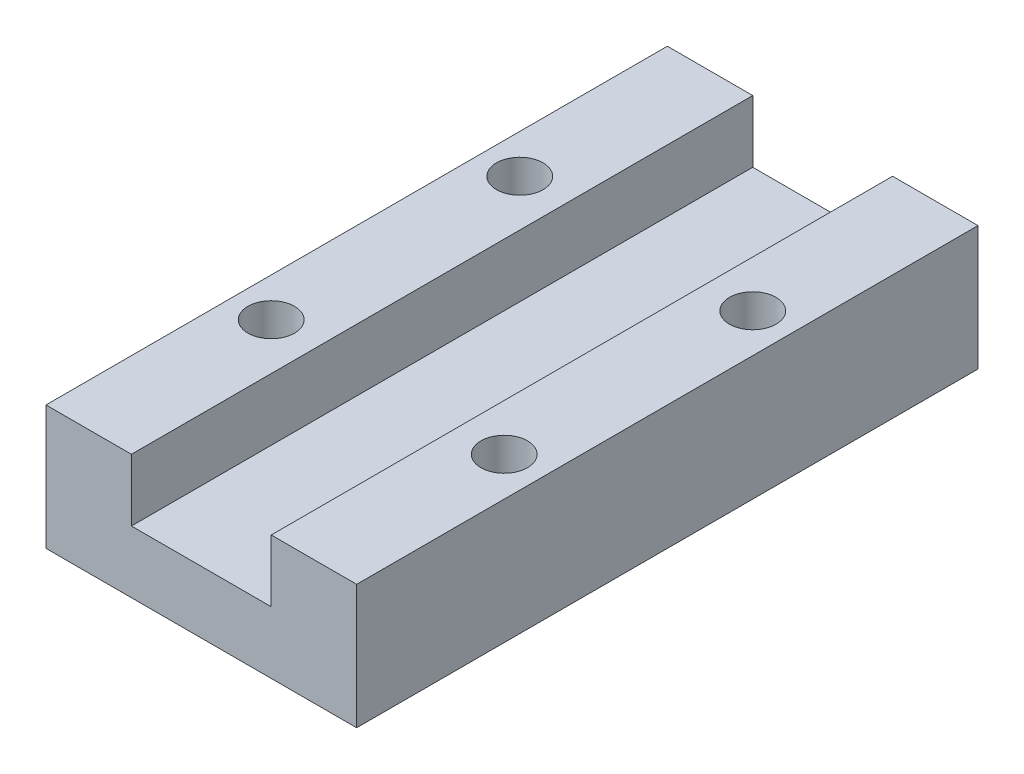
ISO-10303-21;
HEADER;
FILE_DESCRIPTION(('STEP AP214'),'2;1');
FILE_NAME('part.step','',(''),(''),'','','');
FILE_SCHEMA(('AUTOMOTIVE_DESIGN { 1 0 10303 214 1 1 1 1 }'));
ENDSEC;
DATA;
#1=APPLICATION_CONTEXT('core data for automotive mechanical design processes');
#2=APPLICATION_PROTOCOL_DEFINITION('international standard','automotive_design',2000,#1);
#3=PRODUCT_CONTEXT('',#1,'mechanical');
#4=PRODUCT('Part','Part','',(#3));
#5=PRODUCT_RELATED_PRODUCT_CATEGORY('part','',(#4));
#6=PRODUCT_DEFINITION_FORMATION('','',#4);
#7=PRODUCT_DEFINITION_CONTEXT('part definition',#1,'design');
#8=PRODUCT_DEFINITION('design','',#6,#7);
#9=PRODUCT_DEFINITION_SHAPE('','',#8);
#10=(LENGTH_UNIT() NAMED_UNIT(*) SI_UNIT(.MILLI.,.METRE.));
#11=(NAMED_UNIT(*) PLANE_ANGLE_UNIT() SI_UNIT($,.RADIAN.));
#12=(NAMED_UNIT(*) SI_UNIT($,.STERADIAN.) SOLID_ANGLE_UNIT());
#13=UNCERTAINTY_MEASURE_WITH_UNIT(LENGTH_MEASURE(1.E-05),#10,'distance_accuracy_value','');
#14=(GEOMETRIC_REPRESENTATION_CONTEXT(3) GLOBAL_UNCERTAINTY_ASSIGNED_CONTEXT((#13)) GLOBAL_UNIT_ASSIGNED_CONTEXT((#10,
#11,#12)) REPRESENTATION_CONTEXT('',''));
#15=CARTESIAN_POINT('',(0.,0.,0.));
#16=DIRECTION('',(0.,0.,1.));
#17=DIRECTION('',(1.,0.,0.));
#18=AXIS2_PLACEMENT_3D('',#15,#16,#17);
#19=CARTESIAN_POINT('',(0.,8.,0.));
#20=DIRECTION('',(0.,1.,0.));
#21=DIRECTION('',(0.,0.,1.));
#22=AXIS2_PLACEMENT_3D('',#19,#20,#21);
#23=PLANE('',#22);
#24=DIRECTION('',(0.,0.,1.));
#25=VECTOR('',#24,1.);
#26=CARTESIAN_POINT('',(5.5,8.,0.));
#27=LINE('',#26,#25);
#28=CARTESIAN_POINT('',(5.5,8.,0.));
#29=VERTEX_POINT('',#28);
#30=CARTESIAN_POINT('',(5.50000000000001,8.,40.));
#31=VERTEX_POINT('',#30);
#32=EDGE_CURVE('E115',#29,#31,#27,.T.);
#33=ORIENTED_EDGE('',*,*,#32,.F.);
#34=DIRECTION('',(-1.,0.,0.));
#35=VECTOR('',#34,1.);
#36=CARTESIAN_POINT('',(0.,8.,0.));
#37=LINE('',#36,#35);
#38=CARTESIAN_POINT('',(0.,8.,0.));
#39=VERTEX_POINT('',#38);
#40=EDGE_CURVE('E60',#29,#39,#37,.T.);
#41=ORIENTED_EDGE('',*,*,#40,.T.);
#42=DIRECTION('',(0.,0.,1.));
#43=VECTOR('',#42,1.);
#44=CARTESIAN_POINT('',(0.,8.,0.));
#45=LINE('',#44,#43);
#46=CARTESIAN_POINT('',(0.,8.,40.));
#47=VERTEX_POINT('',#46);
#48=EDGE_CURVE('E168',#39,#47,#45,.T.);
#49=ORIENTED_EDGE('',*,*,#48,.T.);
#50=DIRECTION('',(1.,0.,0.));
#51=VECTOR('',#50,1.);
#52=CARTESIAN_POINT('',(0.,8.,40.));
#53=LINE('',#52,#51);
#54=EDGE_CURVE('E89',#47,#31,#53,.T.);
#55=ORIENTED_EDGE('',*,*,#54,.T.);
#56=EDGE_LOOP('',(#33,#41,#49,#55));
#57=FACE_BOUND('',#56,.T.);
#58=CARTESIAN_POINT('',(2.5,8.,28.));
#59=DIRECTION('',(0.,1.,0.));
#60=DIRECTION('',(0.,0.,1.));
#61=AXIS2_PLACEMENT_3D('',#58,#59,#60);
#62=CIRCLE('',#61,1.5);
#63=CARTESIAN_POINT('',(2.5,8.,29.5));
#64=VERTEX_POINT('',#63);
#65=EDGE_CURVE('E147',#64,#64,#62,.T.);
#66=ORIENTED_EDGE('',*,*,#65,.F.);
#67=EDGE_LOOP('',(#66));
#68=FACE_BOUND('',#67,.T.);
#69=CARTESIAN_POINT('',(2.49999999999994,8.,12.));
#70=DIRECTION('',(0.,1.,0.));
#71=DIRECTION('',(0.,0.,1.));
#72=AXIS2_PLACEMENT_3D('',#69,#70,#71);
#73=CIRCLE('',#72,1.5);
#74=CARTESIAN_POINT('',(2.49999999999994,8.,13.5));
#75=VERTEX_POINT('',#74);
#76=EDGE_CURVE('E139',#75,#75,#73,.T.);
#77=ORIENTED_EDGE('',*,*,#76,.F.);
#78=EDGE_LOOP('',(#77));
#79=FACE_BOUND('',#78,.T.);
#80=ADVANCED_FACE('F36',(#57,#68,#79),#23,.T.);
#81=CARTESIAN_POINT('',(0.,8.,0.));
#82=DIRECTION('',(1.,0.,0.));
#83=DIRECTION('',(0.,0.,-1.));
#84=AXIS2_PLACEMENT_3D('',#81,#82,#83);
#85=PLANE('',#84);
#86=DIRECTION('',(0.,0.,1.));
#87=VECTOR('',#86,1.);
#88=CARTESIAN_POINT('',(0.,0.,0.));
#89=LINE('',#88,#87);
#90=CARTESIAN_POINT('',(0.,0.,0.));
#91=VERTEX_POINT('',#90);
#92=CARTESIAN_POINT('',(0.,0.,40.));
#93=VERTEX_POINT('',#92);
#94=EDGE_CURVE('E165',#91,#93,#89,.T.);
#95=ORIENTED_EDGE('',*,*,#94,.T.);
#96=DIRECTION('',(0.,-1.,0.));
#97=VECTOR('',#96,1.);
#98=CARTESIAN_POINT('',(0.,8.,40.));
#99=LINE('',#98,#97);
#100=EDGE_CURVE('E11',#47,#93,#99,.T.);
#101=ORIENTED_EDGE('',*,*,#100,.F.);
#102=ORIENTED_EDGE('',*,*,#48,.F.);
#103=DIRECTION('',(0.,-1.,0.));
#104=VECTOR('',#103,1.);
#105=CARTESIAN_POINT('',(0.,8.,0.));
#106=LINE('',#105,#104);
#107=EDGE_CURVE('E177',#39,#91,#106,.T.);
#108=ORIENTED_EDGE('',*,*,#107,.T.);
#109=EDGE_LOOP('',(#95,#101,#102,#108));
#110=FACE_BOUND('',#109,.T.);
#111=ADVANCED_FACE('F38',(#110),#85,.F.);
#112=CARTESIAN_POINT('',(0.,8.,40.));
#113=DIRECTION('',(0.,0.,-1.));
#114=DIRECTION('',(-1.,0.,0.));
#115=AXIS2_PLACEMENT_3D('',#112,#113,#114);
#116=PLANE('',#115);
#117=DIRECTION('',(1.,0.,0.));
#118=VECTOR('',#117,1.);
#119=CARTESIAN_POINT('',(5.50000000000001,4.,40.));
#120=LINE('',#119,#118);
#121=CARTESIAN_POINT('',(5.50000000000001,4.,40.));
#122=VERTEX_POINT('',#121);
#123=CARTESIAN_POINT('',(14.5,4.,40.));
#124=VERTEX_POINT('',#123);
#125=EDGE_CURVE('E123',#122,#124,#120,.T.);
#126=ORIENTED_EDGE('',*,*,#125,.F.);
#127=DIRECTION('',(0.,1.,0.));
#128=VECTOR('',#127,1.);
#129=CARTESIAN_POINT('',(5.50000000000001,4.,40.));
#130=LINE('',#129,#128);
#131=EDGE_CURVE('E110',#122,#31,#130,.T.);
#132=ORIENTED_EDGE('',*,*,#131,.T.);
#133=ORIENTED_EDGE('',*,*,#54,.F.);
#134=ORIENTED_EDGE('',*,*,#100,.T.);
#135=DIRECTION('',(1.,0.,0.));
#136=VECTOR('',#135,1.);
#137=CARTESIAN_POINT('',(0.,0.,40.));
#138=LINE('',#137,#136);
#139=CARTESIAN_POINT('',(20.,0.,40.));
#140=VERTEX_POINT('',#139);
#141=EDGE_CURVE('E180',#93,#140,#138,.T.);
#142=ORIENTED_EDGE('',*,*,#141,.T.);
#143=DIRECTION('',(0.,-1.,0.));
#144=VECTOR('',#143,1.);
#145=CARTESIAN_POINT('',(20.,8.,40.));
#146=LINE('',#145,#144);
#147=CARTESIAN_POINT('',(20.,8.,40.));
#148=VERTEX_POINT('',#147);
#149=EDGE_CURVE('E44',#148,#140,#146,.T.);
#150=ORIENTED_EDGE('',*,*,#149,.F.);
#151=CARTESIAN_POINT('',(14.5,8.,40.));
#152=VERTEX_POINT('',#151);
#153=EDGE_CURVE('E170',#152,#148,#53,.T.);
#154=ORIENTED_EDGE('',*,*,#153,.F.);
#155=DIRECTION('',(0.,1.,0.));
#156=VECTOR('',#155,1.);
#157=CARTESIAN_POINT('',(14.5,4.,40.));
#158=LINE('',#157,#156);
#159=EDGE_CURVE('E51',#124,#152,#158,.T.);
#160=ORIENTED_EDGE('',*,*,#159,.F.);
#161=EDGE_LOOP('',(#126,#132,#133,#134,#142,#150,#154,#160));
#162=FACE_BOUND('',#161,.T.);
#163=ADVANCED_FACE('F128',(#162),#116,.F.);
#164=CARTESIAN_POINT('',(20.,8.,0.));
#165=DIRECTION('',(-1.,0.,0.));
#166=DIRECTION('',(0.,0.,1.));
#167=AXIS2_PLACEMENT_3D('',#164,#165,#166);
#168=PLANE('',#167);
#169=DIRECTION('',(0.,0.,-1.));
#170=VECTOR('',#169,1.);
#171=CARTESIAN_POINT('',(20.,0.,0.));
#172=LINE('',#171,#170);
#173=CARTESIAN_POINT('',(20.,0.,0.));
#174=VERTEX_POINT('',#173);
#175=EDGE_CURVE('E182',#140,#174,#172,.T.);
#176=ORIENTED_EDGE('',*,*,#175,.T.);
#177=DIRECTION('',(0.,-1.,0.));
#178=VECTOR('',#177,1.);
#179=CARTESIAN_POINT('',(20.,8.,0.));
#180=LINE('',#179,#178);
#181=CARTESIAN_POINT('',(20.,8.,0.));
#182=VERTEX_POINT('',#181);
#183=EDGE_CURVE('E186',#182,#174,#180,.T.);
#184=ORIENTED_EDGE('',*,*,#183,.F.);
#185=DIRECTION('',(0.,0.,-1.));
#186=VECTOR('',#185,1.);
#187=CARTESIAN_POINT('',(20.,8.,0.));
#188=LINE('',#187,#186);
#189=EDGE_CURVE('E172',#148,#182,#188,.T.);
#190=ORIENTED_EDGE('',*,*,#189,.F.);
#191=ORIENTED_EDGE('',*,*,#149,.T.);
#192=EDGE_LOOP('',(#176,#184,#190,#191));
#193=FACE_BOUND('',#192,.T.);
#194=ADVANCED_FACE('F192',(#193),#168,.F.);
#195=CARTESIAN_POINT('',(0.,8.,0.));
#196=DIRECTION('',(0.,0.,1.));
#197=DIRECTION('',(1.,0.,0.));
#198=AXIS2_PLACEMENT_3D('',#195,#196,#197);
#199=PLANE('',#198);
#200=ORIENTED_EDGE('',*,*,#40,.F.);
#201=DIRECTION('',(0.,1.,0.));
#202=VECTOR('',#201,1.);
#203=CARTESIAN_POINT('',(5.5,4.,0.));
#204=LINE('',#203,#202);
#205=CARTESIAN_POINT('',(5.5,4.,0.));
#206=VERTEX_POINT('',#205);
#207=EDGE_CURVE('E137',#206,#29,#204,.T.);
#208=ORIENTED_EDGE('',*,*,#207,.F.);
#209=DIRECTION('',(-1.,0.,0.));
#210=VECTOR('',#209,1.);
#211=CARTESIAN_POINT('',(5.5,4.,0.));
#212=LINE('',#211,#210);
#213=CARTESIAN_POINT('',(14.5,4.,0.));
#214=VERTEX_POINT('',#213);
#215=EDGE_CURVE('E117',#214,#206,#212,.T.);
#216=ORIENTED_EDGE('',*,*,#215,.F.);
#217=DIRECTION('',(0.,1.,0.));
#218=VECTOR('',#217,1.);
#219=CARTESIAN_POINT('',(14.5,4.,0.));
#220=LINE('',#219,#218);
#221=CARTESIAN_POINT('',(14.5,8.,0.));
#222=VERTEX_POINT('',#221);
#223=EDGE_CURVE('E140',#214,#222,#220,.T.);
#224=ORIENTED_EDGE('',*,*,#223,.T.);
#225=EDGE_CURVE('E174',#182,#222,#37,.T.);
#226=ORIENTED_EDGE('',*,*,#225,.F.);
#227=ORIENTED_EDGE('',*,*,#183,.T.);
#228=DIRECTION('',(-1.,0.,0.));
#229=VECTOR('',#228,1.);
#230=CARTESIAN_POINT('',(0.,0.,0.));
#231=LINE('',#230,#229);
#232=EDGE_CURVE('E82',#174,#91,#231,.T.);
#233=ORIENTED_EDGE('',*,*,#232,.T.);
#234=ORIENTED_EDGE('',*,*,#107,.F.);
#235=EDGE_LOOP('',(#200,#208,#216,#224,#226,#227,#233,#234));
#236=FACE_BOUND('',#235,.T.);
#237=ADVANCED_FACE('F200',(#236),#199,.F.);
#238=DIRECTION('',(0.,0.,-1.));
#239=VECTOR('',#238,1.);
#240=CARTESIAN_POINT('',(14.5,8.,0.));
#241=LINE('',#240,#239);
#242=EDGE_CURVE('E126',#152,#222,#241,.T.);
#243=ORIENTED_EDGE('',*,*,#242,.F.);
#244=ORIENTED_EDGE('',*,*,#153,.T.);
#245=ORIENTED_EDGE('',*,*,#189,.T.);
#246=ORIENTED_EDGE('',*,*,#225,.T.);
#247=EDGE_LOOP('',(#243,#244,#245,#246));
#248=FACE_BOUND('',#247,.T.);
#249=CARTESIAN_POINT('',(17.4999999999999,8.,12.));
#250=DIRECTION('',(0.,1.,0.));
#251=DIRECTION('',(0.,0.,1.));
#252=AXIS2_PLACEMENT_3D('',#249,#250,#251);
#253=CIRCLE('',#252,1.5);
#254=CARTESIAN_POINT('',(17.4999999999999,8.,13.5));
#255=VERTEX_POINT('',#254);
#256=EDGE_CURVE('E154',#255,#255,#253,.T.);
#257=ORIENTED_EDGE('',*,*,#256,.F.);
#258=EDGE_LOOP('',(#257));
#259=FACE_BOUND('',#258,.T.);
#260=CARTESIAN_POINT('',(17.5,8.,28.));
#261=DIRECTION('',(0.,1.,0.));
#262=DIRECTION('',(0.,0.,1.));
#263=AXIS2_PLACEMENT_3D('',#260,#261,#262);
#264=CIRCLE('',#263,1.5);
#265=CARTESIAN_POINT('',(17.5,8.,29.5));
#266=VERTEX_POINT('',#265);
#267=EDGE_CURVE('E148',#266,#266,#264,.T.);
#268=ORIENTED_EDGE('',*,*,#267,.F.);
#269=EDGE_LOOP('',(#268));
#270=FACE_BOUND('',#269,.T.);
#271=ADVANCED_FACE('F204',(#248,#259,#270),#23,.T.);
#272=CARTESIAN_POINT('',(0.,0.,0.));
#273=DIRECTION('',(0.,1.,0.));
#274=DIRECTION('',(0.,0.,1.));
#275=AXIS2_PLACEMENT_3D('',#272,#273,#274);
#276=PLANE('',#275);
#277=CARTESIAN_POINT('',(2.49999999999994,0.,12.));
#278=DIRECTION('',(0.,1.,0.));
#279=DIRECTION('',(0.,0.,1.));
#280=AXIS2_PLACEMENT_3D('',#277,#278,#279);
#281=CIRCLE('',#280,1.5);
#282=CARTESIAN_POINT('',(2.49999999999994,0.,13.5));
#283=VERTEX_POINT('',#282);
#284=EDGE_CURVE('E157',#283,#283,#281,.T.);
#285=ORIENTED_EDGE('',*,*,#284,.T.);
#286=EDGE_LOOP('',(#285));
#287=FACE_BOUND('',#286,.T.);
#288=CARTESIAN_POINT('',(17.4999999999999,0.,12.));
#289=DIRECTION('',(0.,1.,0.));
#290=DIRECTION('',(0.,0.,1.));
#291=AXIS2_PLACEMENT_3D('',#288,#289,#290);
#292=CIRCLE('',#291,1.5);
#293=CARTESIAN_POINT('',(17.4999999999999,0.,13.5));
#294=VERTEX_POINT('',#293);
#295=EDGE_CURVE('E151',#294,#294,#292,.T.);
#296=ORIENTED_EDGE('',*,*,#295,.T.);
#297=EDGE_LOOP('',(#296));
#298=FACE_BOUND('',#297,.T.);
#299=CARTESIAN_POINT('',(17.5,0.,28.));
#300=DIRECTION('',(0.,1.,0.));
#301=DIRECTION('',(0.,0.,1.));
#302=AXIS2_PLACEMENT_3D('',#299,#300,#301);
#303=CIRCLE('',#302,1.5);
#304=CARTESIAN_POINT('',(17.5,0.,29.5));
#305=VERTEX_POINT('',#304);
#306=EDGE_CURVE('E144',#305,#305,#303,.T.);
#307=ORIENTED_EDGE('',*,*,#306,.T.);
#308=EDGE_LOOP('',(#307));
#309=FACE_BOUND('',#308,.T.);
#310=CARTESIAN_POINT('',(2.5,0.,28.));
#311=DIRECTION('',(0.,1.,0.));
#312=DIRECTION('',(0.,0.,1.));
#313=AXIS2_PLACEMENT_3D('',#310,#311,#312);
#314=CIRCLE('',#313,1.5);
#315=CARTESIAN_POINT('',(2.5,0.,29.5));
#316=VERTEX_POINT('',#315);
#317=EDGE_CURVE('E162',#316,#316,#314,.T.);
#318=ORIENTED_EDGE('',*,*,#317,.T.);
#319=EDGE_LOOP('',(#318));
#320=FACE_BOUND('',#319,.T.);
#321=ORIENTED_EDGE('',*,*,#94,.F.);
#322=ORIENTED_EDGE('',*,*,#232,.F.);
#323=ORIENTED_EDGE('',*,*,#175,.F.);
#324=ORIENTED_EDGE('',*,*,#141,.F.);
#325=EDGE_LOOP('',(#321,#322,#323,#324));
#326=FACE_BOUND('',#325,.T.);
#327=ADVANCED_FACE('F196',(#287,#298,#309,#320,#326),#276,.F.);
#328=CARTESIAN_POINT('',(2.5,0.,28.));
#329=DIRECTION('',(0.,1.,0.));
#330=DIRECTION('',(0.,0.,1.));
#331=AXIS2_PLACEMENT_3D('',#328,#329,#330);
#332=CYLINDRICAL_SURFACE('',#331,1.5);
#333=ORIENTED_EDGE('',*,*,#317,.F.);
#334=EDGE_LOOP('',(#333));
#335=FACE_BOUND('',#334,.T.);
#336=ORIENTED_EDGE('',*,*,#65,.T.);
#337=EDGE_LOOP('',(#336));
#338=FACE_BOUND('',#337,.T.);
#339=ADVANCED_FACE('F226',(#335,#338),#332,.F.);
#340=CARTESIAN_POINT('',(17.5,0.,28.));
#341=DIRECTION('',(0.,1.,0.));
#342=DIRECTION('',(0.,0.,1.));
#343=AXIS2_PLACEMENT_3D('',#340,#341,#342);
#344=CYLINDRICAL_SURFACE('',#343,1.5);
#345=ORIENTED_EDGE('',*,*,#306,.F.);
#346=EDGE_LOOP('',(#345));
#347=FACE_BOUND('',#346,.T.);
#348=ORIENTED_EDGE('',*,*,#267,.T.);
#349=EDGE_LOOP('',(#348));
#350=FACE_BOUND('',#349,.T.);
#351=ADVANCED_FACE('F220',(#347,#350),#344,.F.);
#352=CARTESIAN_POINT('',(17.4999999999999,0.,12.));
#353=DIRECTION('',(0.,1.,0.));
#354=DIRECTION('',(0.,0.,1.));
#355=AXIS2_PLACEMENT_3D('',#352,#353,#354);
#356=CYLINDRICAL_SURFACE('',#355,1.5);
#357=ORIENTED_EDGE('',*,*,#295,.F.);
#358=EDGE_LOOP('',(#357));
#359=FACE_BOUND('',#358,.T.);
#360=ORIENTED_EDGE('',*,*,#256,.T.);
#361=EDGE_LOOP('',(#360));
#362=FACE_BOUND('',#361,.T.);
#363=ADVANCED_FACE('F211',(#359,#362),#356,.F.);
#364=CARTESIAN_POINT('',(2.49999999999994,0.,12.));
#365=DIRECTION('',(0.,1.,0.));
#366=DIRECTION('',(0.,0.,1.));
#367=AXIS2_PLACEMENT_3D('',#364,#365,#366);
#368=CYLINDRICAL_SURFACE('',#367,1.5);
#369=ORIENTED_EDGE('',*,*,#284,.F.);
#370=EDGE_LOOP('',(#369));
#371=FACE_BOUND('',#370,.T.);
#372=ORIENTED_EDGE('',*,*,#76,.T.);
#373=EDGE_LOOP('',(#372));
#374=FACE_BOUND('',#373,.T.);
#375=ADVANCED_FACE('F209',(#371,#374),#368,.F.);
#376=CARTESIAN_POINT('',(5.5,4.,0.));
#377=DIRECTION('',(-1.,0.,0.));
#378=DIRECTION('',(0.,0.,1.));
#379=AXIS2_PLACEMENT_3D('',#376,#377,#378);
#380=PLANE('',#379);
#381=ORIENTED_EDGE('',*,*,#32,.T.);
#382=ORIENTED_EDGE('',*,*,#131,.F.);
#383=DIRECTION('',(0.,0.,1.));
#384=VECTOR('',#383,1.);
#385=CARTESIAN_POINT('',(5.5,4.,0.));
#386=LINE('',#385,#384);
#387=EDGE_CURVE('E113',#206,#122,#386,.T.);
#388=ORIENTED_EDGE('',*,*,#387,.F.);
#389=ORIENTED_EDGE('',*,*,#207,.T.);
#390=EDGE_LOOP('',(#381,#382,#388,#389));
#391=FACE_BOUND('',#390,.T.);
#392=ADVANCED_FACE('F112',(#391),#380,.F.);
#393=CARTESIAN_POINT('',(14.5,4.,0.));
#394=DIRECTION('',(1.,0.,0.));
#395=DIRECTION('',(0.,0.,-1.));
#396=AXIS2_PLACEMENT_3D('',#393,#394,#395);
#397=PLANE('',#396);
#398=ORIENTED_EDGE('',*,*,#242,.T.);
#399=ORIENTED_EDGE('',*,*,#223,.F.);
#400=DIRECTION('',(0.,0.,-1.));
#401=VECTOR('',#400,1.);
#402=CARTESIAN_POINT('',(14.5,4.,0.));
#403=LINE('',#402,#401);
#404=EDGE_CURVE('E130',#124,#214,#403,.T.);
#405=ORIENTED_EDGE('',*,*,#404,.F.);
#406=ORIENTED_EDGE('',*,*,#159,.T.);
#407=EDGE_LOOP('',(#398,#399,#405,#406));
#408=FACE_BOUND('',#407,.T.);
#409=ADVANCED_FACE('F218',(#408),#397,.F.);
#410=CARTESIAN_POINT('',(0.,4.,0.));
#411=DIRECTION('',(0.,1.,0.));
#412=DIRECTION('',(0.,0.,1.));
#413=AXIS2_PLACEMENT_3D('',#410,#411,#412);
#414=PLANE('',#413);
#415=ORIENTED_EDGE('',*,*,#387,.T.);
#416=ORIENTED_EDGE('',*,*,#125,.T.);
#417=ORIENTED_EDGE('',*,*,#404,.T.);
#418=ORIENTED_EDGE('',*,*,#215,.T.);
#419=EDGE_LOOP('',(#415,#416,#417,#418));
#420=FACE_BOUND('',#419,.T.);
#421=ADVANCED_FACE('F121',(#420),#414,.T.);
#422=CLOSED_SHELL('',(#80,#111,#163,#194,#237,#271,#327,#339,#351,#363,#375,#392,#409,#421));
#423=MANIFOLD_SOLID_BREP('B2',#422);
#424=ADVANCED_BREP_SHAPE_REPRESENTATION('',(#18,#423),#14);
#425=SHAPE_DEFINITION_REPRESENTATION(#9,#424);
ENDSEC;
END-ISO-10303-21;
